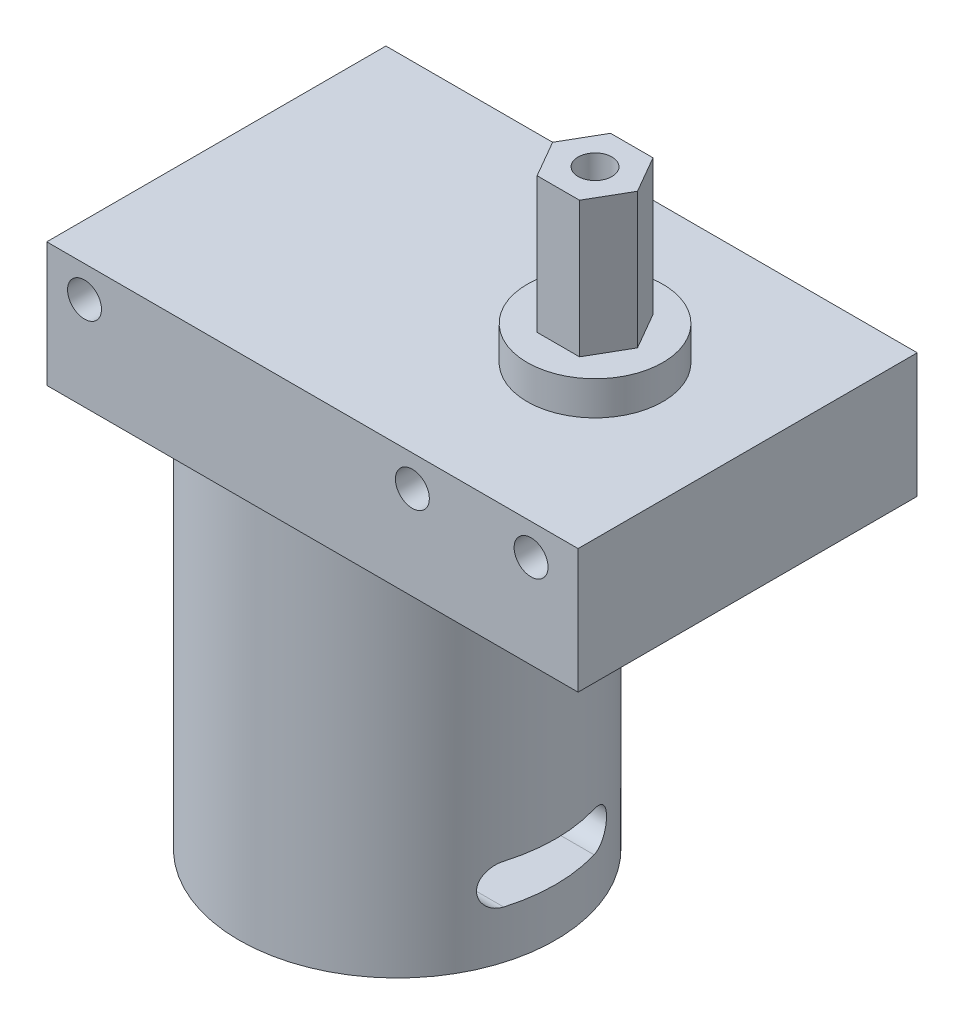
ISO-10303-21;
HEADER;
FILE_DESCRIPTION(('STEP AP214'),'2;1');
FILE_NAME('part.step','',(''),(''),'','','');
FILE_SCHEMA(('AUTOMOTIVE_DESIGN { 1 0 10303 214 1 1 1 1 }'));
ENDSEC;
DATA;
#1=APPLICATION_CONTEXT('core data for automotive mechanical design processes');
#2=APPLICATION_PROTOCOL_DEFINITION('international standard','automotive_design',2000,#1);
#3=PRODUCT_CONTEXT('',#1,'mechanical');
#4=PRODUCT('Part','Part','',(#3));
#5=PRODUCT_RELATED_PRODUCT_CATEGORY('part','',(#4));
#6=PRODUCT_DEFINITION_FORMATION('','',#4);
#7=PRODUCT_DEFINITION_CONTEXT('part definition',#1,'design');
#8=PRODUCT_DEFINITION('design','',#6,#7);
#9=PRODUCT_DEFINITION_SHAPE('','',#8);
#10=(LENGTH_UNIT() NAMED_UNIT(*) SI_UNIT(.MILLI.,.METRE.));
#11=(NAMED_UNIT(*) PLANE_ANGLE_UNIT() SI_UNIT($,.RADIAN.));
#12=(NAMED_UNIT(*) SI_UNIT($,.STERADIAN.) SOLID_ANGLE_UNIT());
#13=UNCERTAINTY_MEASURE_WITH_UNIT(LENGTH_MEASURE(1.E-05),#10,'distance_accuracy_value','');
#14=(GEOMETRIC_REPRESENTATION_CONTEXT(3) GLOBAL_UNCERTAINTY_ASSIGNED_CONTEXT((#13)) GLOBAL_UNIT_ASSIGNED_CONTEXT((#10,
#11,#12)) REPRESENTATION_CONTEXT('',''));
#15=CARTESIAN_POINT('',(0.,0.,0.));
#16=DIRECTION('',(0.,0.,1.));
#17=DIRECTION('',(1.,0.,0.));
#18=AXIS2_PLACEMENT_3D('',#15,#16,#17);
#19=CARTESIAN_POINT('',(16.,-35.,15.));
#20=DIRECTION('',(0.,-1.,0.));
#21=DIRECTION('',(0.,0.,-1.));
#22=AXIS2_PLACEMENT_3D('',#19,#20,#21);
#23=PLANE('',#22);
#24=CARTESIAN_POINT('',(16.,-35.,15.));
#25=DIRECTION('',(0.,-1.,0.));
#26=DIRECTION('',(0.,0.,-1.));
#27=AXIS2_PLACEMENT_3D('',#24,#25,#26);
#28=CIRCLE('',#27,14.);
#29=CARTESIAN_POINT('',(16.,-35.,0.999999999999999));
#30=VERTEX_POINT('',#29);
#31=EDGE_CURVE('E228',#30,#30,#28,.T.);
#32=ORIENTED_EDGE('',*,*,#31,.T.);
#33=EDGE_LOOP('',(#32));
#34=FACE_BOUND('',#33,.T.);
#35=CARTESIAN_POINT('',(16.,-35.,15.));
#36=DIRECTION('',(0.,-1.,0.));
#37=DIRECTION('',(0.,0.,-1.));
#38=AXIS2_PLACEMENT_3D('',#35,#36,#37);
#39=CIRCLE('',#38,5.);
#40=CARTESIAN_POINT('',(16.,-35.,10.));
#41=VERTEX_POINT('',#40);
#42=EDGE_CURVE('E231',#41,#41,#39,.T.);
#43=ORIENTED_EDGE('',*,*,#42,.F.);
#44=EDGE_LOOP('',(#43));
#45=FACE_BOUND('',#44,.T.);
#46=ADVANCED_FACE('F37',(#34,#45),#23,.T.);
#47=CARTESIAN_POINT('',(0.,0.,0.));
#48=DIRECTION('',(0.,1.,0.));
#49=DIRECTION('',(0.,0.,1.));
#50=AXIS2_PLACEMENT_3D('',#47,#48,#49);
#51=PLANE('',#50);
#52=DIRECTION('',(0.,0.,1.));
#53=VECTOR('',#52,1.);
#54=CARTESIAN_POINT('',(0.,0.,0.));
#55=LINE('',#54,#53);
#56=CARTESIAN_POINT('',(0.,0.,0.));
#57=VERTEX_POINT('',#56);
#58=CARTESIAN_POINT('',(0.,0.,30.));
#59=VERTEX_POINT('',#58);
#60=EDGE_CURVE('E291',#57,#59,#55,.T.);
#61=ORIENTED_EDGE('',*,*,#60,.F.);
#62=DIRECTION('',(-1.,0.,0.));
#63=VECTOR('',#62,1.);
#64=CARTESIAN_POINT('',(0.,0.,0.));
#65=LINE('',#64,#63);
#66=CARTESIAN_POINT('',(47.,0.,0.));
#67=VERTEX_POINT('',#66);
#68=EDGE_CURVE('E298',#67,#57,#65,.T.);
#69=ORIENTED_EDGE('',*,*,#68,.F.);
#70=DIRECTION('',(0.,0.,-1.));
#71=VECTOR('',#70,1.);
#72=CARTESIAN_POINT('',(47.,0.,0.));
#73=LINE('',#72,#71);
#74=CARTESIAN_POINT('',(47.,0.,30.));
#75=VERTEX_POINT('',#74);
#76=EDGE_CURVE('E309',#75,#67,#73,.T.);
#77=ORIENTED_EDGE('',*,*,#76,.F.);
#78=DIRECTION('',(1.,0.,0.));
#79=VECTOR('',#78,1.);
#80=CARTESIAN_POINT('',(0.,0.,30.));
#81=LINE('',#80,#79);
#82=EDGE_CURVE('E307',#59,#75,#81,.T.);
#83=ORIENTED_EDGE('',*,*,#82,.F.);
#84=EDGE_LOOP('',(#61,#69,#77,#83));
#85=FACE_BOUND('',#84,.T.);
#86=CARTESIAN_POINT('',(16.,0.,15.));
#87=DIRECTION('',(0.,1.,0.));
#88=DIRECTION('',(0.,0.,1.));
#89=AXIS2_PLACEMENT_3D('',#86,#87,#88);
#90=CIRCLE('',#89,14.);
#91=CARTESIAN_POINT('',(16.,0.,29.));
#92=VERTEX_POINT('',#91);
#93=EDGE_CURVE('E169',#92,#92,#90,.F.);
#94=ORIENTED_EDGE('',*,*,#93,.F.);
#95=EDGE_LOOP('',(#94));
#96=FACE_BOUND('',#95,.T.);
#97=ADVANCED_FACE('F217',(#85,#96),#51,.F.);
#98=CARTESIAN_POINT('',(33.5,14.,15.));
#99=DIRECTION('',(0.,1.,0.));
#100=DIRECTION('',(0.,0.,1.));
#101=AXIS2_PLACEMENT_3D('',#98,#99,#100);
#102=PLANE('',#101);
#103=CARTESIAN_POINT('',(33.5,14.,15.));
#104=DIRECTION('',(0.,1.,0.));
#105=DIRECTION('',(0.,0.,1.));
#106=AXIS2_PLACEMENT_3D('',#103,#104,#105);
#107=CIRCLE('',#106,5.99999999999999);
#108=CARTESIAN_POINT('',(33.5,14.,21.));
#109=VERTEX_POINT('',#108);
#110=EDGE_CURVE('E288',#109,#109,#107,.T.);
#111=ORIENTED_EDGE('',*,*,#110,.T.);
#112=EDGE_LOOP('',(#111));
#113=FACE_BOUND('',#112,.T.);
#114=DIRECTION('',(-0.5,0.,-0.866025403784438));
#115=VECTOR('',#114,1.);
#116=CARTESIAN_POINT('',(37.2527767497326,14.,15.));
#117=LINE('',#116,#115);
#118=CARTESIAN_POINT('',(37.2527767497326,14.,15.));
#119=VERTEX_POINT('',#118);
#120=CARTESIAN_POINT('',(35.3763883748663,14.,11.75));
#121=VERTEX_POINT('',#120);
#122=EDGE_CURVE('E262',#119,#121,#117,.T.);
#123=ORIENTED_EDGE('',*,*,#122,.F.);
#124=DIRECTION('',(0.5,0.,-0.866025403784439));
#125=VECTOR('',#124,1.);
#126=CARTESIAN_POINT('',(35.3763883748663,14.,18.25));
#127=LINE('',#126,#125);
#128=CARTESIAN_POINT('',(35.3763883748663,14.,18.25));
#129=VERTEX_POINT('',#128);
#130=EDGE_CURVE('E244',#129,#119,#127,.T.);
#131=ORIENTED_EDGE('',*,*,#130,.F.);
#132=DIRECTION('',(1.,0.,0.));
#133=VECTOR('',#132,1.);
#134=CARTESIAN_POINT('',(31.6236116251337,14.,18.25));
#135=LINE('',#134,#133);
#136=CARTESIAN_POINT('',(31.6236116251337,14.,18.25));
#137=VERTEX_POINT('',#136);
#138=EDGE_CURVE('E249',#137,#129,#135,.T.);
#139=ORIENTED_EDGE('',*,*,#138,.F.);
#140=DIRECTION('',(0.5,0.,0.866025403784438));
#141=VECTOR('',#140,1.);
#142=CARTESIAN_POINT('',(29.7472232502674,14.,15.));
#143=LINE('',#142,#141);
#144=CARTESIAN_POINT('',(29.7472232502674,14.,15.));
#145=VERTEX_POINT('',#144);
#146=EDGE_CURVE('E268',#145,#137,#143,.T.);
#147=ORIENTED_EDGE('',*,*,#146,.F.);
#148=DIRECTION('',(-0.5,0.,0.866025403784439));
#149=VECTOR('',#148,1.);
#150=CARTESIAN_POINT('',(31.6236116251337,14.,11.75));
#151=LINE('',#150,#149);
#152=CARTESIAN_POINT('',(31.6236116251337,14.,11.75));
#153=VERTEX_POINT('',#152);
#154=EDGE_CURVE('E266',#153,#145,#151,.T.);
#155=ORIENTED_EDGE('',*,*,#154,.F.);
#156=DIRECTION('',(-1.,0.,0.));
#157=VECTOR('',#156,1.);
#158=CARTESIAN_POINT('',(35.3763883748663,14.,11.75));
#159=LINE('',#158,#157);
#160=EDGE_CURVE('E264',#121,#153,#159,.T.);
#161=ORIENTED_EDGE('',*,*,#160,.F.);
#162=EDGE_LOOP('',(#123,#131,#139,#147,#155,#161));
#163=FACE_BOUND('',#162,.T.);
#164=ADVANCED_FACE('F222',(#113,#163),#102,.T.);
#165=CARTESIAN_POINT('',(0.,11.,0.));
#166=DIRECTION('',(0.,1.,0.));
#167=DIRECTION('',(0.,0.,1.));
#168=AXIS2_PLACEMENT_3D('',#165,#166,#167);
#169=PLANE('',#168);
#170=DIRECTION('',(0.,0.,1.));
#171=VECTOR('',#170,1.);
#172=CARTESIAN_POINT('',(0.,11.,0.));
#173=LINE('',#172,#171);
#174=CARTESIAN_POINT('',(0.,11.,0.));
#175=VERTEX_POINT('',#174);
#176=CARTESIAN_POINT('',(0.,11.,30.));
#177=VERTEX_POINT('',#176);
#178=EDGE_CURVE('E294',#175,#177,#173,.T.);
#179=ORIENTED_EDGE('',*,*,#178,.T.);
#180=DIRECTION('',(1.,0.,0.));
#181=VECTOR('',#180,1.);
#182=CARTESIAN_POINT('',(0.,11.,30.));
#183=LINE('',#182,#181);
#184=CARTESIAN_POINT('',(47.,11.,30.));
#185=VERTEX_POINT('',#184);
#186=EDGE_CURVE('E297',#177,#185,#183,.T.);
#187=ORIENTED_EDGE('',*,*,#186,.T.);
#188=DIRECTION('',(0.,0.,-1.));
#189=VECTOR('',#188,1.);
#190=CARTESIAN_POINT('',(47.,11.,0.));
#191=LINE('',#190,#189);
#192=CARTESIAN_POINT('',(47.,11.,0.));
#193=VERTEX_POINT('',#192);
#194=EDGE_CURVE('E300',#185,#193,#191,.T.);
#195=ORIENTED_EDGE('',*,*,#194,.T.);
#196=DIRECTION('',(-1.,0.,0.));
#197=VECTOR('',#196,1.);
#198=CARTESIAN_POINT('',(0.,11.,0.));
#199=LINE('',#198,#197);
#200=EDGE_CURVE('E302',#193,#175,#199,.T.);
#201=ORIENTED_EDGE('',*,*,#200,.T.);
#202=EDGE_LOOP('',(#179,#187,#195,#201));
#203=FACE_BOUND('',#202,.T.);
#204=CARTESIAN_POINT('',(33.5,11.,15.));
#205=DIRECTION('',(0.,1.,0.));
#206=DIRECTION('',(0.,0.,1.));
#207=AXIS2_PLACEMENT_3D('',#204,#205,#206);
#208=CIRCLE('',#207,5.99999999999999);
#209=CARTESIAN_POINT('',(33.5,11.,21.));
#210=VERTEX_POINT('',#209);
#211=EDGE_CURVE('E287',#210,#210,#208,.T.);
#212=ORIENTED_EDGE('',*,*,#211,.F.);
#213=EDGE_LOOP('',(#212));
#214=FACE_BOUND('',#213,.T.);
#215=ADVANCED_FACE('F364',(#203,#214),#169,.T.);
#216=CARTESIAN_POINT('',(0.,11.,0.));
#217=DIRECTION('',(1.,0.,0.));
#218=DIRECTION('',(0.,0.,-1.));
#219=AXIS2_PLACEMENT_3D('',#216,#217,#218);
#220=PLANE('',#219);
#221=ORIENTED_EDGE('',*,*,#60,.T.);
#222=DIRECTION('',(0.,-1.,0.));
#223=VECTOR('',#222,1.);
#224=CARTESIAN_POINT('',(0.,11.,30.));
#225=LINE('',#224,#223);
#226=EDGE_CURVE('E320',#177,#59,#225,.T.);
#227=ORIENTED_EDGE('',*,*,#226,.F.);
#228=ORIENTED_EDGE('',*,*,#178,.F.);
#229=DIRECTION('',(0.,-1.,0.));
#230=VECTOR('',#229,1.);
#231=CARTESIAN_POINT('',(0.,11.,0.));
#232=LINE('',#231,#230);
#233=EDGE_CURVE('E304',#175,#57,#232,.T.);
#234=ORIENTED_EDGE('',*,*,#233,.T.);
#235=EDGE_LOOP('',(#221,#227,#228,#234));
#236=FACE_BOUND('',#235,.T.);
#237=ADVANCED_FACE('F39',(#236),#220,.F.);
#238=CARTESIAN_POINT('',(0.,11.,30.));
#239=DIRECTION('',(0.,0.,-1.));
#240=DIRECTION('',(-1.,0.,0.));
#241=AXIS2_PLACEMENT_3D('',#238,#239,#240);
#242=PLANE('',#241);
#243=CARTESIAN_POINT('',(42.8407573826274,8.25,30.));
#244=DIRECTION('',(0.,0.,1.));
#245=DIRECTION('',(1.,0.,0.));
#246=AXIS2_PLACEMENT_3D('',#243,#244,#245);
#247=CIRCLE('',#246,1.5);
#248=CARTESIAN_POINT('',(44.3407573826274,8.25,30.));
#249=VERTEX_POINT('',#248);
#250=EDGE_CURVE('E389',#249,#249,#247,.T.);
#251=ORIENTED_EDGE('',*,*,#250,.F.);
#252=EDGE_LOOP('',(#251));
#253=FACE_BOUND('',#252,.T.);
#254=CARTESIAN_POINT('',(32.3407573826274,8.25,30.));
#255=DIRECTION('',(0.,0.,1.));
#256=DIRECTION('',(1.,0.,0.));
#257=AXIS2_PLACEMENT_3D('',#254,#255,#256);
#258=CIRCLE('',#257,1.5);
#259=CARTESIAN_POINT('',(33.8407573826274,8.25,30.));
#260=VERTEX_POINT('',#259);
#261=EDGE_CURVE('E393',#260,#260,#258,.T.);
#262=ORIENTED_EDGE('',*,*,#261,.F.);
#263=EDGE_LOOP('',(#262));
#264=FACE_BOUND('',#263,.T.);
#265=CARTESIAN_POINT('',(3.34075738262738,8.25,30.));
#266=DIRECTION('',(0.,0.,1.));
#267=DIRECTION('',(1.,0.,0.));
#268=AXIS2_PLACEMENT_3D('',#265,#266,#267);
#269=CIRCLE('',#268,1.5);
#270=CARTESIAN_POINT('',(4.84075738262738,8.25,30.));
#271=VERTEX_POINT('',#270);
#272=EDGE_CURVE('E239',#271,#271,#269,.T.);
#273=ORIENTED_EDGE('',*,*,#272,.F.);
#274=EDGE_LOOP('',(#273));
#275=FACE_BOUND('',#274,.T.);
#276=ORIENTED_EDGE('',*,*,#82,.T.);
#277=DIRECTION('',(0.,-1.,0.));
#278=VECTOR('',#277,1.);
#279=CARTESIAN_POINT('',(47.,11.,30.));
#280=LINE('',#279,#278);
#281=EDGE_CURVE('E317',#185,#75,#280,.T.);
#282=ORIENTED_EDGE('',*,*,#281,.F.);
#283=ORIENTED_EDGE('',*,*,#186,.F.);
#284=ORIENTED_EDGE('',*,*,#226,.T.);
#285=EDGE_LOOP('',(#276,#282,#283,#284));
#286=FACE_BOUND('',#285,.T.);
#287=ADVANCED_FACE('F378',(#253,#264,#275,#286),#242,.F.);
#288=CARTESIAN_POINT('',(47.,11.,0.));
#289=DIRECTION('',(-1.,0.,0.));
#290=DIRECTION('',(0.,0.,1.));
#291=AXIS2_PLACEMENT_3D('',#288,#289,#290);
#292=PLANE('',#291);
#293=ORIENTED_EDGE('',*,*,#76,.T.);
#294=DIRECTION('',(0.,-1.,0.));
#295=VECTOR('',#294,1.);
#296=CARTESIAN_POINT('',(47.,11.,0.));
#297=LINE('',#296,#295);
#298=EDGE_CURVE('E314',#193,#67,#297,.T.);
#299=ORIENTED_EDGE('',*,*,#298,.F.);
#300=ORIENTED_EDGE('',*,*,#194,.F.);
#301=ORIENTED_EDGE('',*,*,#281,.T.);
#302=EDGE_LOOP('',(#293,#299,#300,#301));
#303=FACE_BOUND('',#302,.T.);
#304=ADVANCED_FACE('F375',(#303),#292,.F.);
#305=CARTESIAN_POINT('',(0.,11.,0.));
#306=DIRECTION('',(0.,0.,1.));
#307=DIRECTION('',(1.,0.,0.));
#308=AXIS2_PLACEMENT_3D('',#305,#306,#307);
#309=PLANE('',#308);
#310=CARTESIAN_POINT('',(42.8407573826274,8.25,0.));
#311=DIRECTION('',(0.,0.,1.));
#312=DIRECTION('',(1.,0.,0.));
#313=AXIS2_PLACEMENT_3D('',#310,#311,#312);
#314=CIRCLE('',#313,1.5);
#315=CARTESIAN_POINT('',(44.3407573826274,8.25,0.));
#316=VERTEX_POINT('',#315);
#317=EDGE_CURVE('E416',#316,#316,#314,.T.);
#318=ORIENTED_EDGE('',*,*,#317,.T.);
#319=EDGE_LOOP('',(#318));
#320=FACE_BOUND('',#319,.T.);
#321=CARTESIAN_POINT('',(32.3407573826274,8.25,0.));
#322=DIRECTION('',(0.,0.,1.));
#323=DIRECTION('',(1.,0.,0.));
#324=AXIS2_PLACEMENT_3D('',#321,#322,#323);
#325=CIRCLE('',#324,1.5);
#326=CARTESIAN_POINT('',(33.8407573826274,8.25,0.));
#327=VERTEX_POINT('',#326);
#328=EDGE_CURVE('E412',#327,#327,#325,.T.);
#329=ORIENTED_EDGE('',*,*,#328,.T.);
#330=EDGE_LOOP('',(#329));
#331=FACE_BOUND('',#330,.T.);
#332=CARTESIAN_POINT('',(3.34075738262738,8.25,0.));
#333=DIRECTION('',(0.,0.,1.));
#334=DIRECTION('',(1.,0.,0.));
#335=AXIS2_PLACEMENT_3D('',#332,#333,#334);
#336=CIRCLE('',#335,1.5);
#337=CARTESIAN_POINT('',(4.84075738262738,8.25,0.));
#338=VERTEX_POINT('',#337);
#339=EDGE_CURVE('E234',#338,#338,#336,.T.);
#340=ORIENTED_EDGE('',*,*,#339,.T.);
#341=EDGE_LOOP('',(#340));
#342=FACE_BOUND('',#341,.T.);
#343=ORIENTED_EDGE('',*,*,#68,.T.);
#344=ORIENTED_EDGE('',*,*,#233,.F.);
#345=ORIENTED_EDGE('',*,*,#200,.F.);
#346=ORIENTED_EDGE('',*,*,#298,.T.);
#347=EDGE_LOOP('',(#343,#344,#345,#346));
#348=FACE_BOUND('',#347,.T.);
#349=ADVANCED_FACE('F368',(#320,#331,#342,#348),#309,.F.);
#350=CARTESIAN_POINT('',(33.5,14.,15.));
#351=DIRECTION('',(0.,-1.,0.));
#352=DIRECTION('',(0.,0.,-1.));
#353=AXIS2_PLACEMENT_3D('',#350,#351,#352);
#354=CYLINDRICAL_SURFACE('',#353,5.99999999999999);
#355=ORIENTED_EDGE('',*,*,#110,.F.);
#356=EDGE_LOOP('',(#355));
#357=FACE_BOUND('',#356,.T.);
#358=ORIENTED_EDGE('',*,*,#211,.T.);
#359=EDGE_LOOP('',(#358));
#360=FACE_BOUND('',#359,.T.);
#361=ADVANCED_FACE('F360',(#357,#360),#354,.T.);
#362=CARTESIAN_POINT('',(35.3763883748663,26.,18.25));
#363=DIRECTION('',(-0.866025403784439,0.,-0.5));
#364=DIRECTION('',(-0.5,0.,0.866025403784439));
#365=AXIS2_PLACEMENT_3D('',#362,#363,#364);
#366=PLANE('',#365);
#367=ORIENTED_EDGE('',*,*,#130,.T.);
#368=DIRECTION('',(0.,-1.,0.));
#369=VECTOR('',#368,1.);
#370=CARTESIAN_POINT('',(37.2527767497326,26.,15.));
#371=LINE('',#370,#369);
#372=CARTESIAN_POINT('',(37.2527767497326,26.,15.));
#373=VERTEX_POINT('',#372);
#374=EDGE_CURVE('E285',#373,#119,#371,.T.);
#375=ORIENTED_EDGE('',*,*,#374,.F.);
#376=DIRECTION('',(0.5,0.,-0.866025403784439));
#377=VECTOR('',#376,1.);
#378=CARTESIAN_POINT('',(35.3763883748663,26.,18.25));
#379=LINE('',#378,#377);
#380=CARTESIAN_POINT('',(35.3763883748663,26.,18.25));
#381=VERTEX_POINT('',#380);
#382=EDGE_CURVE('E245',#381,#373,#379,.T.);
#383=ORIENTED_EDGE('',*,*,#382,.F.);
#384=DIRECTION('',(0.,-1.,0.));
#385=VECTOR('',#384,1.);
#386=CARTESIAN_POINT('',(35.3763883748663,26.,18.25));
#387=LINE('',#386,#385);
#388=EDGE_CURVE('E259',#381,#129,#387,.T.);
#389=ORIENTED_EDGE('',*,*,#388,.T.);
#390=EDGE_LOOP('',(#367,#375,#383,#389));
#391=FACE_BOUND('',#390,.T.);
#392=ADVANCED_FACE('F356',(#391),#366,.F.);
#393=CARTESIAN_POINT('',(37.2527767497326,26.,15.));
#394=DIRECTION('',(-0.866025403784439,0.,0.5));
#395=DIRECTION('',(0.5,0.,0.866025403784439));
#396=AXIS2_PLACEMENT_3D('',#393,#394,#395);
#397=PLANE('',#396);
#398=ORIENTED_EDGE('',*,*,#122,.T.);
#399=DIRECTION('',(0.,-1.,0.));
#400=VECTOR('',#399,1.);
#401=CARTESIAN_POINT('',(35.3763883748663,26.,11.75));
#402=LINE('',#401,#400);
#403=CARTESIAN_POINT('',(35.3763883748663,26.,11.75));
#404=VERTEX_POINT('',#403);
#405=EDGE_CURVE('E282',#404,#121,#402,.T.);
#406=ORIENTED_EDGE('',*,*,#405,.F.);
#407=DIRECTION('',(-0.5,0.,-0.866025403784438));
#408=VECTOR('',#407,1.);
#409=CARTESIAN_POINT('',(37.2527767497326,26.,15.));
#410=LINE('',#409,#408);
#411=EDGE_CURVE('E248',#373,#404,#410,.T.);
#412=ORIENTED_EDGE('',*,*,#411,.F.);
#413=ORIENTED_EDGE('',*,*,#374,.T.);
#414=EDGE_LOOP('',(#398,#406,#412,#413));
#415=FACE_BOUND('',#414,.T.);
#416=ADVANCED_FACE('F352',(#415),#397,.F.);
#417=CARTESIAN_POINT('',(35.3763883748663,26.,11.75));
#418=DIRECTION('',(0.,0.,1.));
#419=DIRECTION('',(1.,0.,0.));
#420=AXIS2_PLACEMENT_3D('',#417,#418,#419);
#421=PLANE('',#420);
#422=ORIENTED_EDGE('',*,*,#160,.T.);
#423=DIRECTION('',(0.,-1.,0.));
#424=VECTOR('',#423,1.);
#425=CARTESIAN_POINT('',(31.6236116251337,26.,11.75));
#426=LINE('',#425,#424);
#427=CARTESIAN_POINT('',(31.6236116251337,26.,11.75));
#428=VERTEX_POINT('',#427);
#429=EDGE_CURVE('E279',#428,#153,#426,.T.);
#430=ORIENTED_EDGE('',*,*,#429,.F.);
#431=DIRECTION('',(-1.,0.,0.));
#432=VECTOR('',#431,1.);
#433=CARTESIAN_POINT('',(35.3763883748663,26.,11.75));
#434=LINE('',#433,#432);
#435=EDGE_CURVE('E251',#404,#428,#434,.T.);
#436=ORIENTED_EDGE('',*,*,#435,.F.);
#437=ORIENTED_EDGE('',*,*,#405,.T.);
#438=EDGE_LOOP('',(#422,#430,#436,#437));
#439=FACE_BOUND('',#438,.T.);
#440=ADVANCED_FACE('F348',(#439),#421,.F.);
#441=CARTESIAN_POINT('',(31.6236116251337,26.,11.75));
#442=DIRECTION('',(0.866025403784439,0.,0.5));
#443=DIRECTION('',(0.5,0.,-0.866025403784439));
#444=AXIS2_PLACEMENT_3D('',#441,#442,#443);
#445=PLANE('',#444);
#446=ORIENTED_EDGE('',*,*,#154,.T.);
#447=DIRECTION('',(0.,-1.,0.));
#448=VECTOR('',#447,1.);
#449=CARTESIAN_POINT('',(29.7472232502674,26.,15.));
#450=LINE('',#449,#448);
#451=CARTESIAN_POINT('',(29.7472232502674,26.,15.));
#452=VERTEX_POINT('',#451);
#453=EDGE_CURVE('E276',#452,#145,#450,.T.);
#454=ORIENTED_EDGE('',*,*,#453,.F.);
#455=DIRECTION('',(-0.5,0.,0.866025403784439));
#456=VECTOR('',#455,1.);
#457=CARTESIAN_POINT('',(31.6236116251337,26.,11.75));
#458=LINE('',#457,#456);
#459=EDGE_CURVE('E253',#428,#452,#458,.T.);
#460=ORIENTED_EDGE('',*,*,#459,.F.);
#461=ORIENTED_EDGE('',*,*,#429,.T.);
#462=EDGE_LOOP('',(#446,#454,#460,#461));
#463=FACE_BOUND('',#462,.T.);
#464=ADVANCED_FACE('F344',(#463),#445,.F.);
#465=CARTESIAN_POINT('',(29.7472232502674,26.,15.));
#466=DIRECTION('',(0.866025403784439,0.,-0.5));
#467=DIRECTION('',(-0.5,0.,-0.866025403784439));
#468=AXIS2_PLACEMENT_3D('',#465,#466,#467);
#469=PLANE('',#468);
#470=ORIENTED_EDGE('',*,*,#146,.T.);
#471=DIRECTION('',(0.,-1.,0.));
#472=VECTOR('',#471,1.);
#473=CARTESIAN_POINT('',(31.6236116251337,26.,18.25));
#474=LINE('',#473,#472);
#475=CARTESIAN_POINT('',(31.6236116251337,26.,18.25));
#476=VERTEX_POINT('',#475);
#477=EDGE_CURVE('E274',#476,#137,#474,.T.);
#478=ORIENTED_EDGE('',*,*,#477,.F.);
#479=DIRECTION('',(0.5,0.,0.866025403784438));
#480=VECTOR('',#479,1.);
#481=CARTESIAN_POINT('',(29.7472232502674,26.,15.));
#482=LINE('',#481,#480);
#483=EDGE_CURVE('E255',#452,#476,#482,.T.);
#484=ORIENTED_EDGE('',*,*,#483,.F.);
#485=ORIENTED_EDGE('',*,*,#453,.T.);
#486=EDGE_LOOP('',(#470,#478,#484,#485));
#487=FACE_BOUND('',#486,.T.);
#488=ADVANCED_FACE('F336',(#487),#469,.F.);
#489=CARTESIAN_POINT('',(31.6236116251337,26.,18.25));
#490=DIRECTION('',(0.,0.,-1.));
#491=DIRECTION('',(-1.,0.,0.));
#492=AXIS2_PLACEMENT_3D('',#489,#490,#491);
#493=PLANE('',#492);
#494=ORIENTED_EDGE('',*,*,#138,.T.);
#495=ORIENTED_EDGE('',*,*,#388,.F.);
#496=DIRECTION('',(1.,0.,0.));
#497=VECTOR('',#496,1.);
#498=CARTESIAN_POINT('',(31.6236116251337,26.,18.25));
#499=LINE('',#498,#497);
#500=EDGE_CURVE('E257',#476,#381,#499,.T.);
#501=ORIENTED_EDGE('',*,*,#500,.F.);
#502=ORIENTED_EDGE('',*,*,#477,.T.);
#503=EDGE_LOOP('',(#494,#495,#501,#502));
#504=FACE_BOUND('',#503,.T.);
#505=ADVANCED_FACE('F331',(#504),#493,.F.);
#506=CARTESIAN_POINT('',(0.,26.,0.));
#507=DIRECTION('',(0.,1.,0.));
#508=DIRECTION('',(0.,0.,1.));
#509=AXIS2_PLACEMENT_3D('',#506,#507,#508);
#510=PLANE('',#509);
#511=CARTESIAN_POINT('',(33.5,26.,15.));
#512=DIRECTION('',(0.,1.,0.));
#513=DIRECTION('',(0.,0.,1.));
#514=AXIS2_PLACEMENT_3D('',#511,#512,#513);
#515=CIRCLE('',#514,1.5);
#516=CARTESIAN_POINT('',(33.5,26.,16.5));
#517=VERTEX_POINT('',#516);
#518=EDGE_CURVE('E426',#517,#517,#515,.T.);
#519=ORIENTED_EDGE('',*,*,#518,.F.);
#520=EDGE_LOOP('',(#519));
#521=FACE_BOUND('',#520,.T.);
#522=ORIENTED_EDGE('',*,*,#382,.T.);
#523=ORIENTED_EDGE('',*,*,#411,.T.);
#524=ORIENTED_EDGE('',*,*,#435,.T.);
#525=ORIENTED_EDGE('',*,*,#459,.T.);
#526=ORIENTED_EDGE('',*,*,#483,.T.);
#527=ORIENTED_EDGE('',*,*,#500,.T.);
#528=EDGE_LOOP('',(#522,#523,#524,#525,#526,#527));
#529=FACE_BOUND('',#528,.T.);
#530=ADVANCED_FACE('F327',(#521,#529),#510,.T.);
#531=CARTESIAN_POINT('',(16.,-35.,15.));
#532=DIRECTION('',(0.,1.,0.));
#533=DIRECTION('',(0.,0.,1.));
#534=AXIS2_PLACEMENT_3D('',#531,#532,#533);
#535=CYLINDRICAL_SURFACE('',#534,14.);
#536=CARTESIAN_POINT('',(16.,-27.25,15.));
#537=DIRECTION('',(0.,1.,0.));
#538=DIRECTION('',(0.,0.,1.));
#539=AXIS2_PLACEMENT_3D('',#536,#537,#538);
#540=CIRCLE('',#539,14.);
#541=CARTESIAN_POINT('',(29.4164078649987,-27.25,19.));
#542=VERTEX_POINT('',#541);
#543=CARTESIAN_POINT('',(29.4164078649987,-27.25,11.));
#544=VERTEX_POINT('',#543);
#545=EDGE_CURVE('E50',#542,#544,#540,.T.);
#546=ORIENTED_EDGE('',*,*,#545,.T.);
#547=CARTESIAN_POINT('',(29.4164078649987,-27.25,11.));
#548=CARTESIAN_POINT('',(29.4009505736263,-27.2500013571118,10.9481484949685));
#549=CARTESIAN_POINT('',(29.3851973115395,-27.2523055307532,10.8964157711557));
#550=CARTESIAN_POINT('',(29.3532147991357,-27.2614565880063,10.793510955877));
#551=CARTESIAN_POINT('',(29.3369856267093,-27.2683027321719,10.7423387745314));
#552=CARTESIAN_POINT('',(29.2877938697727,-27.2955368395137,10.5902565545779));
#553=CARTESIAN_POINT('',(29.2542855074683,-27.3226208280628,10.4906418556386));
#554=CARTESIAN_POINT('',(29.1871085445877,-27.3937618037879,10.2978066692511));
#555=CARTESIAN_POINT('',(29.1534399584964,-27.4378172844213,10.2045856151103));
#556=CARTESIAN_POINT('',(29.0873160978216,-27.5418242311755,10.0269589491946));
#557=CARTESIAN_POINT('',(29.0548608734129,-27.6017763538263,9.94255370171244));
#558=CARTESIAN_POINT('',(28.9927082129094,-27.7363129722698,9.78495172650631));
#559=CARTESIAN_POINT('',(28.9630137347517,-27.8109129018539,9.71176696745846));
#560=CARTESIAN_POINT('',(28.9081408210273,-27.9729763720471,9.57920123949277));
#561=CARTESIAN_POINT('',(28.8829612012622,-28.0604365285721,9.5198166497269));
#562=CARTESIAN_POINT('',(28.8400678609597,-28.2407905983935,9.42008464083569));
#563=CARTESIAN_POINT('',(28.8220214668572,-28.3331267782414,9.37887456115723));
#564=CARTESIAN_POINT('',(28.792856208973,-28.5244914044475,9.31280807060967));
#565=CARTESIAN_POINT('',(28.7817324365737,-28.6235150535723,9.28794007137376));
#566=CARTESIAN_POINT('',(28.7679141926918,-28.8165861443776,9.25712389021523));
#567=CARTESIAN_POINT('',(28.7645989858497,-28.910368367026,9.24978176852282));
#568=CARTESIAN_POINT('',(28.7648002145439,-29.0978786214009,9.25022794714365));
#569=CARTESIAN_POINT('',(28.7683149487971,-29.1916066608068,9.25801247952979));
#570=CARTESIAN_POINT('',(28.7816324505206,-29.3723670827668,9.28772240836043));
#571=CARTESIAN_POINT('',(28.7911738742804,-29.4595167756579,9.30906027865145));
#572=CARTESIAN_POINT('',(28.8156789258599,-29.6288527787751,9.36446234825146));
#573=CARTESIAN_POINT('',(28.8306432082558,-29.7110384884168,9.39852808391609));
#574=CARTESIAN_POINT('',(28.8657072862595,-29.8712045293316,9.47953086272761));
#575=CARTESIAN_POINT('',(28.8859627732998,-29.9489506995042,9.52686200562512));
#576=CARTESIAN_POINT('',(28.9302506270026,-30.0955071563768,9.63232964481148));
#577=CARTESIAN_POINT('',(28.9542839804562,-30.1643150997823,9.69046896495844));
#578=CARTESIAN_POINT('',(29.0069786357766,-30.2966622870333,9.82082906794614));
#579=CARTESIAN_POINT('',(29.0358537895785,-30.359387987224,9.89378938030898));
#580=CARTESIAN_POINT('',(29.0954064187095,-30.4718465493623,10.0485150622465));
#581=CARTESIAN_POINT('',(29.1260851400704,-30.5215702963118,10.1302865524754));
#582=CARTESIAN_POINT('',(29.1901069809206,-30.6098689206112,10.3063422686669));
#583=CARTESIAN_POINT('',(29.22349102076,-30.6474751239935,10.4010976432122));
#584=CARTESIAN_POINT('',(29.2896065183108,-30.7057035538527,10.5958107207671));
#585=CARTESIAN_POINT('',(29.3223388898936,-30.7263514808374,10.695760306509));
#586=CARTESIAN_POINT('',(29.3647670860905,-30.7421087531431,10.8305561176962));
#587=CARTESIAN_POINT('',(29.3752648014799,-30.7450661787456,10.8643557979106));
#588=CARTESIAN_POINT('',(29.3960189922165,-30.7490093996228,10.9320861901119));
#589=CARTESIAN_POINT('',(29.4062758160628,-30.7499982419191,10.9660166180242));
#590=CARTESIAN_POINT('',(29.4164078649987,-30.75,11.));
#591=B_SPLINE_CURVE_WITH_KNOTS('',3,(#547,#548,#549,#550,#551,#552,#553,#554,#555,#556,#557,
#558,#559,#560,#561,#562,#563,#564,#565,#566,#567,#568,#569,#570,#571,#572,#573,#574,#575,#576,
#577,#578,#579,#580,#581,#582,#583,#584,#585,#586,#587,#588,#589,#590),.UNSPECIFIED.,.F.,.F.,(4,
2,2,2,2,2,2,2,2,2,2,2,2,2,2,2,2,2,2,2,2,4),(0.,0.162213269936146,0.324400137557108,
0.64834427428792,0.972259661442541,1.29618842835806,1.62046035516602,1.94464710415035,
2.25112638604724,2.55738810459367,2.83833541570882,3.11921275409341,3.38867553347051,
3.65817084968474,3.93672331399788,4.21534865840365,4.51542624864583,4.81571364717902,
5.13609483521937,5.455989580397,5.56249570636635,5.66883685095987),.UNSPECIFIED.);
#592=CARTESIAN_POINT('',(29.4164078649987,-30.75,11.));
#593=VERTEX_POINT('',#592);
#594=EDGE_CURVE('E11',#544,#593,#591,.T.);
#595=ORIENTED_EDGE('',*,*,#594,.T.);
#596=CARTESIAN_POINT('',(16.,-30.75,15.));
#597=DIRECTION('',(0.,-1.,0.));
#598=DIRECTION('',(0.,0.,-1.));
#599=AXIS2_PLACEMENT_3D('',#596,#597,#598);
#600=CIRCLE('',#599,14.);
#601=CARTESIAN_POINT('',(29.4164078649987,-30.75,19.));
#602=VERTEX_POINT('',#601);
#603=EDGE_CURVE('E140',#593,#602,#600,.T.);
#604=ORIENTED_EDGE('',*,*,#603,.T.);
#605=CARTESIAN_POINT('',(29.4164078649987,-30.75,19.));
#606=CARTESIAN_POINT('',(29.4009505736263,-30.7499986428882,19.0518515050315));
#607=CARTESIAN_POINT('',(29.3851973115395,-30.7476944692468,19.1035842288443));
#608=CARTESIAN_POINT('',(29.3532147991357,-30.7385434119937,19.206489044123));
#609=CARTESIAN_POINT('',(29.3369856267093,-30.7316972678281,19.2576612254686));
#610=CARTESIAN_POINT('',(29.2877938697727,-30.7044631604863,19.4097434454221));
#611=CARTESIAN_POINT('',(29.2542855074683,-30.6773791719371,19.5093581443614));
#612=CARTESIAN_POINT('',(29.1871085445877,-30.6062381962121,19.7021933307489));
#613=CARTESIAN_POINT('',(29.1534399584964,-30.5621827155787,19.7954143848897));
#614=CARTESIAN_POINT('',(29.0873160978216,-30.4581757688245,19.9730410508054));
#615=CARTESIAN_POINT('',(29.0548608734129,-30.3982236461736,20.0574462982876));
#616=CARTESIAN_POINT('',(28.9927082129094,-30.2636870277302,20.2150482734937));
#617=CARTESIAN_POINT('',(28.9630137347517,-30.1890870981461,20.2882330325415));
#618=CARTESIAN_POINT('',(28.9081408210273,-30.0270236279529,20.4207987605072));
#619=CARTESIAN_POINT('',(28.8829612012622,-29.9395634714278,20.4801833502731));
#620=CARTESIAN_POINT('',(28.8400678609597,-29.7592094016065,20.5799153591643));
#621=CARTESIAN_POINT('',(28.8220214668572,-29.6668732217586,20.6211254388428));
#622=CARTESIAN_POINT('',(28.792856208973,-29.4755085955525,20.6871919293903));
#623=CARTESIAN_POINT('',(28.7817324365737,-29.3764849464277,20.7120599286262));
#624=CARTESIAN_POINT('',(28.7679141926918,-29.1834138556224,20.7428761097848));
#625=CARTESIAN_POINT('',(28.7645989858497,-29.089631632974,20.7502182314772));
#626=CARTESIAN_POINT('',(28.7648002145439,-28.9021213785991,20.7497720528564));
#627=CARTESIAN_POINT('',(28.7683149487971,-28.8083933391931,20.7419875204702));
#628=CARTESIAN_POINT('',(28.7816324505206,-28.6276329172332,20.7122775916396));
#629=CARTESIAN_POINT('',(28.7911738742804,-28.5404832243421,20.6909397213485));
#630=CARTESIAN_POINT('',(28.8156789258599,-28.3711472212249,20.6355376517485));
#631=CARTESIAN_POINT('',(28.8306432082558,-28.2889615115831,20.6014719160839));
#632=CARTESIAN_POINT('',(28.8657072862595,-28.1287954706684,20.5204691372724));
#633=CARTESIAN_POINT('',(28.8859627732998,-28.0510493004958,20.4731379943749));
#634=CARTESIAN_POINT('',(28.9302506270026,-27.9044928436231,20.3676703551885));
#635=CARTESIAN_POINT('',(28.9542839804562,-27.8356849002177,20.3095310350416));
#636=CARTESIAN_POINT('',(29.0069786357766,-27.7033377129667,20.1791709320539));
#637=CARTESIAN_POINT('',(29.0358537895784,-27.640612012776,20.106210619691));
#638=CARTESIAN_POINT('',(29.0954064187095,-27.5281534506377,19.9514849377535));
#639=CARTESIAN_POINT('',(29.1260851400704,-27.4784297036882,19.8697134475246));
#640=CARTESIAN_POINT('',(29.1901069809206,-27.3901310793888,19.6936577313331));
#641=CARTESIAN_POINT('',(29.22349102076,-27.3525248760065,19.5989023567878));
#642=CARTESIAN_POINT('',(29.2896065183108,-27.2942964461473,19.4041892792329));
#643=CARTESIAN_POINT('',(29.3223388898936,-27.2736485191626,19.304239693491));
#644=CARTESIAN_POINT('',(29.3647670860905,-27.2578912468569,19.1694438823038));
#645=CARTESIAN_POINT('',(29.3752648014799,-27.2549338212544,19.1356442020894));
#646=CARTESIAN_POINT('',(29.3960189922165,-27.2509906003772,19.0679138098881));
#647=CARTESIAN_POINT('',(29.4062758160628,-27.2500017580809,19.0339833819758));
#648=CARTESIAN_POINT('',(29.4164078649987,-27.25,19.));
#649=B_SPLINE_CURVE_WITH_KNOTS('',3,(#605,#606,#607,#608,#609,#610,#611,#612,#613,#614,#615,
#616,#617,#618,#619,#620,#621,#622,#623,#624,#625,#626,#627,#628,#629,#630,#631,#632,#633,#634,
#635,#636,#637,#638,#639,#640,#641,#642,#643,#644,#645,#646,#647,#648),.UNSPECIFIED.,.F.,.F.,(4,
2,2,2,2,2,2,2,2,2,2,2,2,2,2,2,2,2,2,2,2,4),(0.,0.162213269936145,0.324400137557099,
0.648344274287919,0.972259661442539,1.29618842835806,1.62046035516602,1.94464710415035,
2.25112638604724,2.55738810459367,2.83833541570882,3.11921275409341,3.38867553347051,
3.65817084968474,3.93672331399788,4.21534865840365,4.51542624864583,4.81571364717902,
5.13609483521936,5.455989580397,5.56249570636635,5.66883685095987),.UNSPECIFIED.);
#650=EDGE_CURVE('E144',#602,#542,#649,.T.);
#651=ORIENTED_EDGE('',*,*,#650,.T.);
#652=EDGE_LOOP('',(#546,#595,#604,#651));
#653=FACE_BOUND('',#652,.T.);
#654=CARTESIAN_POINT('',(2.58359213500126,-30.75,19.));
#655=VERTEX_POINT('',#654);
#656=CARTESIAN_POINT('',(2.58359213500126,-30.75,11.));
#657=VERTEX_POINT('',#656);
#658=EDGE_CURVE('E147',#655,#657,#600,.T.);
#659=ORIENTED_EDGE('',*,*,#658,.T.);
#660=CARTESIAN_POINT('',(2.58359213500126,-30.75,11.));
#661=CARTESIAN_POINT('',(2.59904942637373,-30.7499986428882,10.9481484949685));
#662=CARTESIAN_POINT('',(2.61480268846053,-30.7476944692468,10.8964157711557));
#663=CARTESIAN_POINT('',(2.6467852008643,-30.7385434119937,10.793510955877));
#664=CARTESIAN_POINT('',(2.66301437329067,-30.7316972678281,10.7423387745314));
#665=CARTESIAN_POINT('',(2.71220613022727,-30.7044631604863,10.5902565545779));
#666=CARTESIAN_POINT('',(2.74571449253172,-30.6773791719371,10.4906418556386));
#667=CARTESIAN_POINT('',(2.81289145541228,-30.6062381962121,10.2978066692511));
#668=CARTESIAN_POINT('',(2.84656004150355,-30.5621827155787,10.2045856151103));
#669=CARTESIAN_POINT('',(2.91268390217843,-30.4581757688244,10.0269589491946));
#670=CARTESIAN_POINT('',(2.94513912658714,-30.3982236461736,9.94255370171245));
#671=CARTESIAN_POINT('',(3.00729178709056,-30.2636870277302,9.78495172650632));
#672=CARTESIAN_POINT('',(3.03698626524831,-30.1890870981461,9.71176696745846));
#673=CARTESIAN_POINT('',(3.09185917897273,-30.0270236279529,9.57920123949277));
#674=CARTESIAN_POINT('',(3.11703879873781,-29.9395634714279,9.51981664972691));
#675=CARTESIAN_POINT('',(3.15993213904033,-29.7592094016065,9.4200846408357));
#676=CARTESIAN_POINT('',(3.17797853314276,-29.6668732217586,9.37887456115723));
#677=CARTESIAN_POINT('',(3.20714379102703,-29.4755085955525,9.31280807060967));
#678=CARTESIAN_POINT('',(3.21826756342633,-29.3764849464277,9.28794007137377));
#679=CARTESIAN_POINT('',(3.23208580730822,-29.1834138556224,9.25712389021523));
#680=CARTESIAN_POINT('',(3.23540101415032,-29.089631632974,9.24978176852282));
#681=CARTESIAN_POINT('',(3.23519978545613,-28.9021213785991,9.25022794714365));
#682=CARTESIAN_POINT('',(3.23168505120288,-28.8083933391931,9.2580124795298));
#683=CARTESIAN_POINT('',(3.21836754947936,-28.6276329172332,9.28772240836043));
#684=CARTESIAN_POINT('',(3.20882612571964,-28.5404832243421,9.30906027865145));
#685=CARTESIAN_POINT('',(3.18432107414011,-28.3711472212249,9.36446234825146));
#686=CARTESIAN_POINT('',(3.16935679174424,-28.2889615115831,9.39852808391609));
#687=CARTESIAN_POINT('',(3.13429271374046,-28.1287954706684,9.47953086272761));
#688=CARTESIAN_POINT('',(3.11403722670019,-28.0510493004958,9.52686200562512));
#689=CARTESIAN_POINT('',(3.06974937299741,-27.9044928436231,9.63232964481148));
#690=CARTESIAN_POINT('',(3.04571601954377,-27.8356849002177,9.69046896495844));
#691=CARTESIAN_POINT('',(2.99302136422336,-27.7033377129667,9.82082906794614));
#692=CARTESIAN_POINT('',(2.96414621042155,-27.640612012776,9.89378938030898));
#693=CARTESIAN_POINT('',(2.90459358129051,-27.5281534506377,10.0485150622465));
#694=CARTESIAN_POINT('',(2.87391485992958,-27.4784297036882,10.1302865524754));
#695=CARTESIAN_POINT('',(2.80989301907936,-27.3901310793888,10.3063422686669));
#696=CARTESIAN_POINT('',(2.77650897924005,-27.3525248760065,10.4010976432122));
#697=CARTESIAN_POINT('',(2.71039348168924,-27.2942964461473,10.5958107207671));
#698=CARTESIAN_POINT('',(2.67766111010641,-27.2736485191626,10.695760306509));
#699=CARTESIAN_POINT('',(2.63523291390952,-27.2578912468569,10.8305561176962));
#700=CARTESIAN_POINT('',(2.62473519852007,-27.2549338212544,10.8643557979106));
#701=CARTESIAN_POINT('',(2.60398100778354,-27.2509906003772,10.9320861901119));
#702=CARTESIAN_POINT('',(2.59372418393721,-27.2500017580809,10.9660166180242));
#703=CARTESIAN_POINT('',(2.58359213500126,-27.25,11.));
#704=B_SPLINE_CURVE_WITH_KNOTS('',3,(#660,#661,#662,#663,#664,#665,#666,#667,#668,#669,#670,
#671,#672,#673,#674,#675,#676,#677,#678,#679,#680,#681,#682,#683,#684,#685,#686,#687,#688,#689,
#690,#691,#692,#693,#694,#695,#696,#697,#698,#699,#700,#701,#702,#703),.UNSPECIFIED.,.F.,.F.,(4,
2,2,2,2,2,2,2,2,2,2,2,2,2,2,2,2,2,2,2,2,4),(0.,0.162213269936145,0.324400137557102,
0.648344274287918,0.972259661442541,1.29618842835806,1.62046035516602,1.94464710415035,
2.25112638604724,2.55738810459367,2.83833541570882,3.11921275409341,3.38867553347051,
3.65817084968474,3.93672331399788,4.21534865840365,4.51542624864583,4.81571364717902,
5.13609483521936,5.45598958039699,5.56249570636635,5.66883685095987),.UNSPECIFIED.);
#705=CARTESIAN_POINT('',(2.58359213500126,-27.25,11.));
#706=VERTEX_POINT('',#705);
#707=EDGE_CURVE('E145',#657,#706,#704,.T.);
#708=ORIENTED_EDGE('',*,*,#707,.T.);
#709=CARTESIAN_POINT('',(2.58359213500126,-27.25,19.));
#710=VERTEX_POINT('',#709);
#711=EDGE_CURVE('E163',#706,#710,#540,.T.);
#712=ORIENTED_EDGE('',*,*,#711,.T.);
#713=CARTESIAN_POINT('',(2.58359213500126,-27.25,19.));
#714=CARTESIAN_POINT('',(2.59904942637373,-27.2500013571118,19.0518515050315));
#715=CARTESIAN_POINT('',(2.61480268846053,-27.2523055307532,19.1035842288443));
#716=CARTESIAN_POINT('',(2.6467852008643,-27.2614565880063,19.206489044123));
#717=CARTESIAN_POINT('',(2.66301437329067,-27.2683027321719,19.2576612254686));
#718=CARTESIAN_POINT('',(2.71220613022728,-27.2955368395137,19.4097434454221));
#719=CARTESIAN_POINT('',(2.74571449253173,-27.3226208280629,19.5093581443614));
#720=CARTESIAN_POINT('',(2.81289145541228,-27.3937618037879,19.7021933307489));
#721=CARTESIAN_POINT('',(2.84656004150355,-27.4378172844213,19.7954143848897));
#722=CARTESIAN_POINT('',(2.91268390217843,-27.5418242311755,19.9730410508054));
#723=CARTESIAN_POINT('',(2.94513912658714,-27.6017763538263,20.0574462982876));
#724=CARTESIAN_POINT('',(3.00729178709057,-27.7363129722698,20.2150482734937));
#725=CARTESIAN_POINT('',(3.03698626524831,-27.8109129018539,20.2882330325415));
#726=CARTESIAN_POINT('',(3.09185917897273,-27.9729763720471,20.4207987605072));
#727=CARTESIAN_POINT('',(3.11703879873781,-28.0604365285721,20.4801833502731));
#728=CARTESIAN_POINT('',(3.15993213904033,-28.2407905983935,20.5799153591643));
#729=CARTESIAN_POINT('',(3.17797853314276,-28.3331267782414,20.6211254388428));
#730=CARTESIAN_POINT('',(3.20714379102703,-28.5244914044475,20.6871919293903));
#731=CARTESIAN_POINT('',(3.21826756342633,-28.6235150535723,20.7120599286262));
#732=CARTESIAN_POINT('',(3.23208580730823,-28.8165861443776,20.7428761097848));
#733=CARTESIAN_POINT('',(3.23540101415032,-28.910368367026,20.7502182314772));
#734=CARTESIAN_POINT('',(3.23519978545613,-29.0978786214009,20.7497720528564));
#735=CARTESIAN_POINT('',(3.23168505120289,-29.1916066608068,20.7419875204702));
#736=CARTESIAN_POINT('',(3.21836754947936,-29.3723670827668,20.7122775916396));
#737=CARTESIAN_POINT('',(3.20882612571964,-29.4595167756579,20.6909397213486));
#738=CARTESIAN_POINT('',(3.18432107414011,-29.6288527787751,20.6355376517485));
#739=CARTESIAN_POINT('',(3.16935679174424,-29.7110384884168,20.6014719160839));
#740=CARTESIAN_POINT('',(3.13429271374046,-29.8712045293316,20.5204691372724));
#741=CARTESIAN_POINT('',(3.1140372267002,-29.9489506995042,20.4731379943749));
#742=CARTESIAN_POINT('',(3.06974937299742,-30.0955071563768,20.3676703551885));
#743=CARTESIAN_POINT('',(3.04571601954377,-30.1643150997823,20.3095310350416));
#744=CARTESIAN_POINT('',(2.99302136422336,-30.2966622870333,20.1791709320539));
#745=CARTESIAN_POINT('',(2.96414621042155,-30.359387987224,20.106210619691));
#746=CARTESIAN_POINT('',(2.90459358129052,-30.4718465493623,19.9514849377535));
#747=CARTESIAN_POINT('',(2.87391485992958,-30.5215702963118,19.8697134475246));
#748=CARTESIAN_POINT('',(2.80989301907936,-30.6098689206112,19.6936577313331));
#749=CARTESIAN_POINT('',(2.77650897924005,-30.6474751239935,19.5989023567878));
#750=CARTESIAN_POINT('',(2.71039348168924,-30.7057035538527,19.4041892792329));
#751=CARTESIAN_POINT('',(2.67766111010641,-30.7263514808374,19.304239693491));
#752=CARTESIAN_POINT('',(2.63523291390952,-30.7421087531431,19.1694438823038));
#753=CARTESIAN_POINT('',(2.62473519852008,-30.7450661787456,19.1356442020894));
#754=CARTESIAN_POINT('',(2.60398100778354,-30.7490093996228,19.0679138098881));
#755=CARTESIAN_POINT('',(2.59372418393721,-30.7499982419191,19.0339833819758));
#756=CARTESIAN_POINT('',(2.58359213500126,-30.75,19.));
#757=B_SPLINE_CURVE_WITH_KNOTS('',3,(#713,#714,#715,#716,#717,#718,#719,#720,#721,#722,#723,
#724,#725,#726,#727,#728,#729,#730,#731,#732,#733,#734,#735,#736,#737,#738,#739,#740,#741,#742,
#743,#744,#745,#746,#747,#748,#749,#750,#751,#752,#753,#754,#755,#756),.UNSPECIFIED.,.F.,.F.,(4,
2,2,2,2,2,2,2,2,2,2,2,2,2,2,2,2,2,2,2,2,4),(0.,0.162213269936141,0.3244001375571,
0.648344274287919,0.972259661442539,1.29618842835805,1.62046035516602,1.94464710415035,
2.25112638604724,2.55738810459367,2.83833541570882,3.11921275409341,3.38867553347051,
3.65817084968474,3.93672331399788,4.21534865840365,4.51542624864583,4.81571364717902,
5.13609483521936,5.455989580397,5.56249570636635,5.66883685095987),.UNSPECIFIED.);
#758=EDGE_CURVE('E167',#710,#655,#757,.T.);
#759=ORIENTED_EDGE('',*,*,#758,.T.);
#760=EDGE_LOOP('',(#659,#708,#712,#759));
#761=FACE_BOUND('',#760,.T.);
#762=ORIENTED_EDGE('',*,*,#31,.F.);
#763=EDGE_LOOP('',(#762));
#764=FACE_BOUND('',#763,.T.);
#765=ORIENTED_EDGE('',*,*,#93,.T.);
#766=EDGE_LOOP('',(#765));
#767=FACE_BOUND('',#766,.T.);
#768=ADVANCED_FACE('F157',(#653,#761,#764,#767),#535,.T.);
#769=CARTESIAN_POINT('',(16.,-37.,15.));
#770=DIRECTION('',(0.,1.,0.));
#771=DIRECTION('',(0.,0.,1.));
#772=AXIS2_PLACEMENT_3D('',#769,#770,#771);
#773=CYLINDRICAL_SURFACE('',#772,5.);
#774=CARTESIAN_POINT('',(16.,-37.,15.));
#775=DIRECTION('',(0.,-1.,0.));
#776=DIRECTION('',(0.,0.,-1.));
#777=AXIS2_PLACEMENT_3D('',#774,#775,#776);
#778=CIRCLE('',#777,5.);
#779=CARTESIAN_POINT('',(16.,-37.,10.));
#780=VERTEX_POINT('',#779);
#781=EDGE_CURVE('E233',#780,#780,#778,.T.);
#782=ORIENTED_EDGE('',*,*,#781,.F.);
#783=EDGE_LOOP('',(#782));
#784=FACE_BOUND('',#783,.T.);
#785=ORIENTED_EDGE('',*,*,#42,.T.);
#786=EDGE_LOOP('',(#785));
#787=FACE_BOUND('',#786,.T.);
#788=ADVANCED_FACE('F212',(#784,#787),#773,.T.);
#789=CARTESIAN_POINT('',(16.,-37.,15.));
#790=DIRECTION('',(0.,-1.,0.));
#791=DIRECTION('',(0.,0.,-1.));
#792=AXIS2_PLACEMENT_3D('',#789,#790,#791);
#793=PLANE('',#792);
#794=ORIENTED_EDGE('',*,*,#781,.T.);
#795=EDGE_LOOP('',(#794));
#796=FACE_BOUND('',#795,.T.);
#797=ADVANCED_FACE('F208',(#796),#793,.T.);
#798=CARTESIAN_POINT('',(3.34075738262738,8.25,0.));
#799=DIRECTION('',(0.,0.,1.));
#800=DIRECTION('',(1.,0.,0.));
#801=AXIS2_PLACEMENT_3D('',#798,#799,#800);
#802=CYLINDRICAL_SURFACE('',#801,1.5);
#803=ORIENTED_EDGE('',*,*,#339,.F.);
#804=EDGE_LOOP('',(#803));
#805=FACE_BOUND('',#804,.T.);
#806=ORIENTED_EDGE('',*,*,#272,.T.);
#807=EDGE_LOOP('',(#806));
#808=FACE_BOUND('',#807,.T.);
#809=ADVANCED_FACE('F204',(#805,#808),#802,.F.);
#810=CARTESIAN_POINT('',(32.3407573826274,8.25,0.));
#811=DIRECTION('',(0.,0.,1.));
#812=DIRECTION('',(1.,0.,0.));
#813=AXIS2_PLACEMENT_3D('',#810,#811,#812);
#814=CYLINDRICAL_SURFACE('',#813,1.5);
#815=ORIENTED_EDGE('',*,*,#328,.F.);
#816=EDGE_LOOP('',(#815));
#817=FACE_BOUND('',#816,.T.);
#818=ORIENTED_EDGE('',*,*,#261,.T.);
#819=EDGE_LOOP('',(#818));
#820=FACE_BOUND('',#819,.T.);
#821=ADVANCED_FACE('F200',(#817,#820),#814,.F.);
#822=CARTESIAN_POINT('',(42.8407573826274,8.25,0.));
#823=DIRECTION('',(0.,0.,1.));
#824=DIRECTION('',(1.,0.,0.));
#825=AXIS2_PLACEMENT_3D('',#822,#823,#824);
#826=CYLINDRICAL_SURFACE('',#825,1.5);
#827=ORIENTED_EDGE('',*,*,#317,.F.);
#828=EDGE_LOOP('',(#827));
#829=FACE_BOUND('',#828,.T.);
#830=ORIENTED_EDGE('',*,*,#250,.T.);
#831=EDGE_LOOP('',(#830));
#832=FACE_BOUND('',#831,.T.);
#833=ADVANCED_FACE('F196',(#829,#832),#826,.F.);
#834=CARTESIAN_POINT('',(47.,-29.,11.));
#835=DIRECTION('',(-1.,0.,0.));
#836=DIRECTION('',(0.,0.,1.));
#837=AXIS2_PLACEMENT_3D('',#834,#835,#836);
#838=CYLINDRICAL_SURFACE('',#837,1.75);
#839=DIRECTION('',(-1.,0.,0.));
#840=VECTOR('',#839,1.);
#841=CARTESIAN_POINT('',(47.,-30.75,11.));
#842=LINE('',#841,#840);
#843=EDGE_CURVE('E62',#593,#657,#842,.T.);
#844=ORIENTED_EDGE('',*,*,#843,.F.);
#845=ORIENTED_EDGE('',*,*,#594,.F.);
#846=DIRECTION('',(-1.,0.,0.));
#847=VECTOR('',#846,1.);
#848=CARTESIAN_POINT('',(47.,-27.25,11.));
#849=LINE('',#848,#847);
#850=EDGE_CURVE('E419',#544,#706,#849,.T.);
#851=ORIENTED_EDGE('',*,*,#850,.T.);
#852=ORIENTED_EDGE('',*,*,#707,.F.);
#853=EDGE_LOOP('',(#844,#845,#851,#852));
#854=FACE_BOUND('',#853,.T.);
#855=ADVANCED_FACE('F149',(#854),#838,.F.);
#856=CARTESIAN_POINT('',(47.,-27.25,11.));
#857=DIRECTION('',(0.,1.,0.));
#858=DIRECTION('',(0.,0.,1.));
#859=AXIS2_PLACEMENT_3D('',#856,#857,#858);
#860=PLANE('',#859);
#861=DIRECTION('',(-1.,0.,0.));
#862=VECTOR('',#861,1.);
#863=CARTESIAN_POINT('',(47.,-27.25,19.));
#864=LINE('',#863,#862);
#865=EDGE_CURVE('E423',#542,#710,#864,.T.);
#866=ORIENTED_EDGE('',*,*,#865,.T.);
#867=ORIENTED_EDGE('',*,*,#711,.F.);
#868=ORIENTED_EDGE('',*,*,#850,.F.);
#869=ORIENTED_EDGE('',*,*,#545,.F.);
#870=EDGE_LOOP('',(#866,#867,#868,#869));
#871=FACE_BOUND('',#870,.T.);
#872=ADVANCED_FACE('F183',(#871),#860,.F.);
#873=CARTESIAN_POINT('',(47.,-29.,19.));
#874=DIRECTION('',(-1.,0.,0.));
#875=DIRECTION('',(0.,0.,1.));
#876=AXIS2_PLACEMENT_3D('',#873,#874,#875);
#877=CYLINDRICAL_SURFACE('',#876,1.75);
#878=ORIENTED_EDGE('',*,*,#865,.F.);
#879=ORIENTED_EDGE('',*,*,#650,.F.);
#880=DIRECTION('',(-1.,0.,0.));
#881=VECTOR('',#880,1.);
#882=CARTESIAN_POINT('',(47.,-30.75,19.));
#883=LINE('',#882,#881);
#884=EDGE_CURVE('E57',#602,#655,#883,.T.);
#885=ORIENTED_EDGE('',*,*,#884,.T.);
#886=ORIENTED_EDGE('',*,*,#758,.F.);
#887=EDGE_LOOP('',(#878,#879,#885,#886));
#888=FACE_BOUND('',#887,.T.);
#889=ADVANCED_FACE('F178',(#888),#877,.F.);
#890=CARTESIAN_POINT('',(47.,-30.75,11.));
#891=DIRECTION('',(0.,-1.,0.));
#892=DIRECTION('',(0.,0.,-1.));
#893=AXIS2_PLACEMENT_3D('',#890,#891,#892);
#894=PLANE('',#893);
#895=ORIENTED_EDGE('',*,*,#843,.T.);
#896=ORIENTED_EDGE('',*,*,#658,.F.);
#897=ORIENTED_EDGE('',*,*,#884,.F.);
#898=ORIENTED_EDGE('',*,*,#603,.F.);
#899=EDGE_LOOP('',(#895,#896,#897,#898));
#900=FACE_BOUND('',#899,.T.);
#901=ADVANCED_FACE('F141',(#900),#894,.F.);
#902=CARTESIAN_POINT('',(33.5,18.,15.));
#903=DIRECTION('',(0.,1.,0.));
#904=DIRECTION('',(0.,0.,1.));
#905=AXIS2_PLACEMENT_3D('',#902,#903,#904);
#906=CYLINDRICAL_SURFACE('',#905,1.5);
#907=CARTESIAN_POINT('',(33.5,18.,15.));
#908=DIRECTION('',(0.,1.,0.));
#909=DIRECTION('',(0.,0.,1.));
#910=AXIS2_PLACEMENT_3D('',#907,#908,#909);
#911=CIRCLE('',#910,1.5);
#912=CARTESIAN_POINT('',(33.5,18.,16.5));
#913=VERTEX_POINT('',#912);
#914=EDGE_CURVE('E154',#913,#913,#911,.T.);
#915=ORIENTED_EDGE('',*,*,#914,.F.);
#916=EDGE_LOOP('',(#915));
#917=FACE_BOUND('',#916,.T.);
#918=ORIENTED_EDGE('',*,*,#518,.T.);
#919=EDGE_LOOP('',(#918));
#920=FACE_BOUND('',#919,.T.);
#921=ADVANCED_FACE('F434',(#917,#920),#906,.F.);
#922=CARTESIAN_POINT('',(33.5,18.,15.));
#923=DIRECTION('',(0.,1.,0.));
#924=DIRECTION('',(0.,0.,1.));
#925=AXIS2_PLACEMENT_3D('',#922,#923,#924);
#926=PLANE('',#925);
#927=ORIENTED_EDGE('',*,*,#914,.T.);
#928=EDGE_LOOP('',(#927));
#929=FACE_BOUND('',#928,.T.);
#930=ADVANCED_FACE('F432',(#929),#926,.T.);
#931=CLOSED_SHELL('',(#46,#97,#164,#215,#237,#287,#304,#349,#361,#392,#416,#440,#464,#488,#505,
#530,#768,#788,#797,#809,#821,#833,#855,#872,#889,#901,#921,#930));
#932=MANIFOLD_SOLID_BREP('B2',#931);
#933=ADVANCED_BREP_SHAPE_REPRESENTATION('',(#18,#932),#14);
#934=SHAPE_DEFINITION_REPRESENTATION(#9,#933);
ENDSEC;
END-ISO-10303-21;
